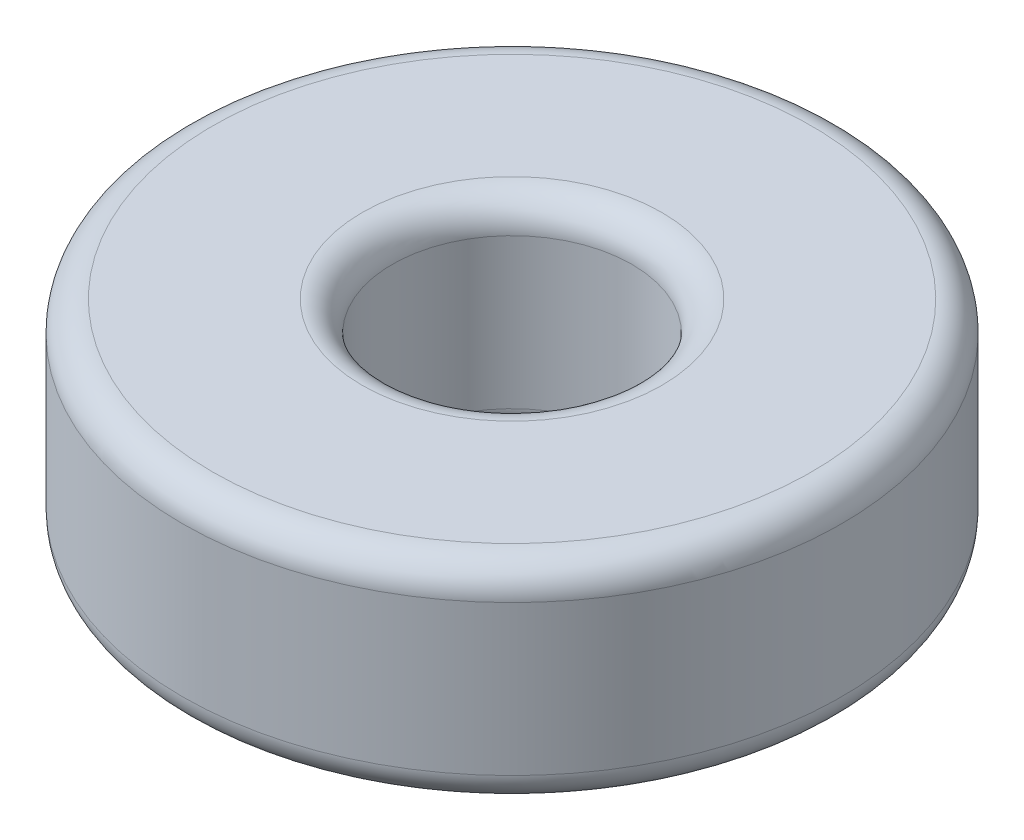
ISO-10303-21;
HEADER;
FILE_DESCRIPTION(('STEP AP214'),'2;1');
FILE_NAME('part.step','',(''),(''),'','','');
FILE_SCHEMA(('AUTOMOTIVE_DESIGN { 1 0 10303 214 1 1 1 1 }'));
ENDSEC;
DATA;
#1=APPLICATION_CONTEXT('core data for automotive mechanical design processes');
#2=APPLICATION_PROTOCOL_DEFINITION('international standard','automotive_design',2000,#1);
#3=PRODUCT_CONTEXT('',#1,'mechanical');
#4=PRODUCT('Part','Part','',(#3));
#5=PRODUCT_RELATED_PRODUCT_CATEGORY('part','',(#4));
#6=PRODUCT_DEFINITION_FORMATION('','',#4);
#7=PRODUCT_DEFINITION_CONTEXT('part definition',#1,'design');
#8=PRODUCT_DEFINITION('design','',#6,#7);
#9=PRODUCT_DEFINITION_SHAPE('','',#8);
#10=(LENGTH_UNIT() NAMED_UNIT(*) SI_UNIT(.MILLI.,.METRE.));
#11=(NAMED_UNIT(*) PLANE_ANGLE_UNIT() SI_UNIT($,.RADIAN.));
#12=(NAMED_UNIT(*) SI_UNIT($,.STERADIAN.) SOLID_ANGLE_UNIT());
#13=UNCERTAINTY_MEASURE_WITH_UNIT(LENGTH_MEASURE(1.E-05),#10,'distance_accuracy_value','');
#14=(GEOMETRIC_REPRESENTATION_CONTEXT(3) GLOBAL_UNCERTAINTY_ASSIGNED_CONTEXT((#13)) GLOBAL_UNIT_ASSIGNED_CONTEXT((#10,
#11,#12)) REPRESENTATION_CONTEXT('',''));
#15=CARTESIAN_POINT('',(0.,0.,0.));
#16=DIRECTION('',(0.,0.,1.));
#17=DIRECTION('',(1.,0.,0.));
#18=AXIS2_PLACEMENT_3D('',#15,#16,#17);
#19=CARTESIAN_POINT('',(0.,7.,0.));
#20=DIRECTION('',(0.,1.,0.));
#21=DIRECTION('',(0.,0.,1.));
#22=AXIS2_PLACEMENT_3D('',#19,#20,#21);
#23=PLANE('',#22);
#24=CARTESIAN_POINT('',(0.,7.,0.));
#25=DIRECTION('',(0.,1.,0.));
#26=DIRECTION('',(0.,0.,1.));
#27=AXIS2_PLACEMENT_3D('',#24,#25,#26);
#28=CIRCLE('',#27,5.);
#29=CARTESIAN_POINT('',(0.,7.,5.));
#30=VERTEX_POINT('',#29);
#31=EDGE_CURVE('E11',#30,#30,#28,.F.);
#32=ORIENTED_EDGE('',*,*,#31,.T.);
#33=EDGE_LOOP('',(#32));
#34=FACE_BOUND('',#33,.T.);
#35=CARTESIAN_POINT('',(0.,7.,0.));
#36=DIRECTION('',(0.,1.,0.));
#37=DIRECTION('',(0.,0.,1.));
#38=AXIS2_PLACEMENT_3D('',#35,#36,#37);
#39=CIRCLE('',#38,10.);
#40=CARTESIAN_POINT('',(0.,7.,10.));
#41=VERTEX_POINT('',#40);
#42=EDGE_CURVE('E57',#41,#41,#39,.T.);
#43=ORIENTED_EDGE('',*,*,#42,.T.);
#44=EDGE_LOOP('',(#43));
#45=FACE_BOUND('',#44,.T.);
#46=ADVANCED_FACE('F49',(#34,#45),#23,.T.);
#47=CARTESIAN_POINT('',(0.,0.,0.));
#48=DIRECTION('',(0.,1.,0.));
#49=DIRECTION('',(0.,0.,1.));
#50=AXIS2_PLACEMENT_3D('',#47,#48,#49);
#51=PLANE('',#50);
#52=CARTESIAN_POINT('',(0.,0.,0.));
#53=DIRECTION('',(0.,1.,0.));
#54=DIRECTION('',(0.,0.,1.));
#55=AXIS2_PLACEMENT_3D('',#52,#53,#54);
#56=CIRCLE('',#55,5.);
#57=CARTESIAN_POINT('',(0.,0.,5.));
#58=VERTEX_POINT('',#57);
#59=EDGE_CURVE('E81',#58,#58,#56,.T.);
#60=ORIENTED_EDGE('',*,*,#59,.T.);
#61=EDGE_LOOP('',(#60));
#62=FACE_BOUND('',#61,.T.);
#63=CARTESIAN_POINT('',(0.,0.,0.));
#64=DIRECTION('',(0.,1.,0.));
#65=DIRECTION('',(0.,0.,1.));
#66=AXIS2_PLACEMENT_3D('',#63,#64,#65);
#67=CIRCLE('',#66,10.);
#68=CARTESIAN_POINT('',(0.,0.,10.));
#69=VERTEX_POINT('',#68);
#70=EDGE_CURVE('E85',#69,#69,#67,.F.);
#71=ORIENTED_EDGE('',*,*,#70,.T.);
#72=EDGE_LOOP('',(#71));
#73=FACE_BOUND('',#72,.T.);
#74=ADVANCED_FACE('F90',(#62,#73),#51,.F.);
#75=CARTESIAN_POINT('',(0.,7.,0.));
#76=DIRECTION('',(0.,-1.,0.));
#77=DIRECTION('',(0.,0.,-1.));
#78=AXIS2_PLACEMENT_3D('',#75,#76,#77);
#79=CYLINDRICAL_SURFACE('',#78,11.);
#80=CARTESIAN_POINT('',(0.,1.,0.));
#81=DIRECTION('',(0.,1.,0.));
#82=DIRECTION('',(0.,0.,1.));
#83=AXIS2_PLACEMENT_3D('',#80,#81,#82);
#84=CIRCLE('',#83,11.);
#85=CARTESIAN_POINT('',(0.,1.,11.));
#86=VERTEX_POINT('',#85);
#87=EDGE_CURVE('E62',#86,#86,#84,.T.);
#88=ORIENTED_EDGE('',*,*,#87,.T.);
#89=EDGE_LOOP('',(#88));
#90=FACE_BOUND('',#89,.T.);
#91=CARTESIAN_POINT('',(0.,6.,0.));
#92=DIRECTION('',(0.,1.,0.));
#93=DIRECTION('',(0.,0.,1.));
#94=AXIS2_PLACEMENT_3D('',#91,#92,#93);
#95=CIRCLE('',#94,11.);
#96=CARTESIAN_POINT('',(0.,6.,11.));
#97=VERTEX_POINT('',#96);
#98=EDGE_CURVE('E67',#97,#97,#95,.F.);
#99=ORIENTED_EDGE('',*,*,#98,.T.);
#100=EDGE_LOOP('',(#99));
#101=FACE_BOUND('',#100,.T.);
#102=ADVANCED_FACE('F100',(#90,#101),#79,.T.);
#103=CARTESIAN_POINT('',(0.,7.,0.));
#104=DIRECTION('',(0.,-1.,0.));
#105=DIRECTION('',(0.,0.,-1.));
#106=AXIS2_PLACEMENT_3D('',#103,#104,#105);
#107=CYLINDRICAL_SURFACE('',#106,4.);
#108=CARTESIAN_POINT('',(0.,1.,0.));
#109=DIRECTION('',(0.,1.,0.));
#110=DIRECTION('',(0.,0.,1.));
#111=AXIS2_PLACEMENT_3D('',#108,#109,#110);
#112=CIRCLE('',#111,4.);
#113=CARTESIAN_POINT('',(0.,1.,4.));
#114=VERTEX_POINT('',#113);
#115=EDGE_CURVE('E73',#114,#114,#112,.F.);
#116=ORIENTED_EDGE('',*,*,#115,.T.);
#117=EDGE_LOOP('',(#116));
#118=FACE_BOUND('',#117,.T.);
#119=CARTESIAN_POINT('',(0.,6.,0.));
#120=DIRECTION('',(0.,1.,0.));
#121=DIRECTION('',(0.,0.,1.));
#122=AXIS2_PLACEMENT_3D('',#119,#120,#121);
#123=CIRCLE('',#122,4.);
#124=CARTESIAN_POINT('',(0.,6.,4.));
#125=VERTEX_POINT('',#124);
#126=EDGE_CURVE('E77',#125,#125,#123,.T.);
#127=ORIENTED_EDGE('',*,*,#126,.T.);
#128=EDGE_LOOP('',(#127));
#129=FACE_BOUND('',#128,.T.);
#130=ADVANCED_FACE('F103',(#118,#129),#107,.F.);
#131=CARTESIAN_POINT('',(0.,1.,0.));
#132=DIRECTION('',(0.,1.,0.));
#133=DIRECTION('',(0.,0.,1.));
#134=AXIS2_PLACEMENT_3D('',#131,#132,#133);
#135=TOROIDAL_SURFACE('',#134,5.,1.);
#136=ORIENTED_EDGE('',*,*,#115,.F.);
#137=EDGE_LOOP('',(#136));
#138=FACE_BOUND('',#137,.T.);
#139=ORIENTED_EDGE('',*,*,#59,.F.);
#140=EDGE_LOOP('',(#139));
#141=FACE_BOUND('',#140,.T.);
#142=ADVANCED_FACE('F96',(#138,#141),#135,.T.);
#143=CARTESIAN_POINT('',(0.,1.,0.));
#144=DIRECTION('',(0.,1.,0.));
#145=DIRECTION('',(0.,0.,1.));
#146=AXIS2_PLACEMENT_3D('',#143,#144,#145);
#147=TOROIDAL_SURFACE('',#146,10.,1.);
#148=ORIENTED_EDGE('',*,*,#70,.F.);
#149=EDGE_LOOP('',(#148));
#150=FACE_BOUND('',#149,.T.);
#151=ORIENTED_EDGE('',*,*,#87,.F.);
#152=EDGE_LOOP('',(#151));
#153=FACE_BOUND('',#152,.T.);
#154=ADVANCED_FACE('F92',(#150,#153),#147,.T.);
#155=CARTESIAN_POINT('',(0.,6.,0.));
#156=DIRECTION('',(0.,1.,0.));
#157=DIRECTION('',(0.,0.,1.));
#158=AXIS2_PLACEMENT_3D('',#155,#156,#157);
#159=TOROIDAL_SURFACE('',#158,5.,1.);
#160=ORIENTED_EDGE('',*,*,#31,.F.);
#161=EDGE_LOOP('',(#160));
#162=FACE_BOUND('',#161,.T.);
#163=ORIENTED_EDGE('',*,*,#126,.F.);
#164=EDGE_LOOP('',(#163));
#165=FACE_BOUND('',#164,.T.);
#166=ADVANCED_FACE('F95',(#162,#165),#159,.T.);
#167=CARTESIAN_POINT('',(0.,6.,0.));
#168=DIRECTION('',(0.,1.,0.));
#169=DIRECTION('',(0.,0.,1.));
#170=AXIS2_PLACEMENT_3D('',#167,#168,#169);
#171=TOROIDAL_SURFACE('',#170,10.,1.);
#172=ORIENTED_EDGE('',*,*,#98,.F.);
#173=EDGE_LOOP('',(#172));
#174=FACE_BOUND('',#173,.T.);
#175=ORIENTED_EDGE('',*,*,#42,.F.);
#176=EDGE_LOOP('',(#175));
#177=FACE_BOUND('',#176,.T.);
#178=ADVANCED_FACE('F51',(#174,#177),#171,.T.);
#179=CLOSED_SHELL('',(#46,#74,#102,#130,#142,#154,#166,#178));
#180=MANIFOLD_SOLID_BREP('B2',#179);
#181=ADVANCED_BREP_SHAPE_REPRESENTATION('',(#18,#180),#14);
#182=SHAPE_DEFINITION_REPRESENTATION(#9,#181);
ENDSEC;
END-ISO-10303-21;
